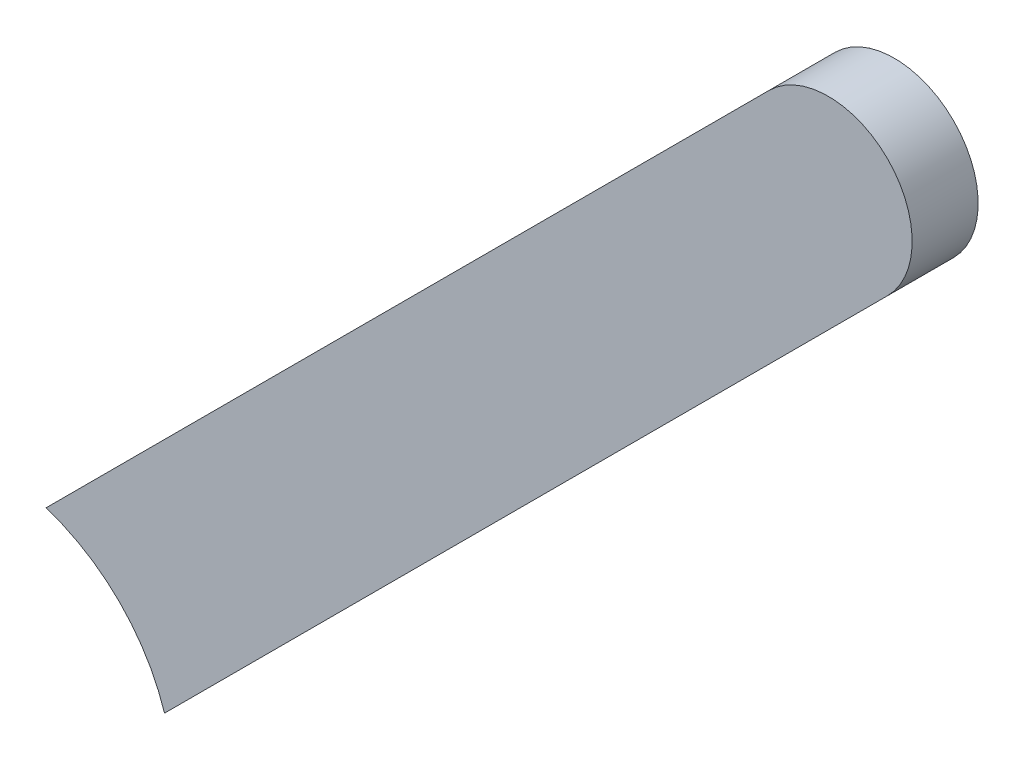
ISO-10303-21;
HEADER;
FILE_DESCRIPTION(('STEP AP214'),'2;1');
FILE_NAME('part.step','',(''),(''),'','','');
FILE_SCHEMA(('AUTOMOTIVE_DESIGN { 1 0 10303 214 1 1 1 1 }'));
ENDSEC;
DATA;
#1=APPLICATION_CONTEXT('core data for automotive mechanical design processes');
#2=APPLICATION_PROTOCOL_DEFINITION('international standard','automotive_design',2000,#1);
#3=PRODUCT_CONTEXT('',#1,'mechanical');
#4=PRODUCT('Part','Part','',(#3));
#5=PRODUCT_RELATED_PRODUCT_CATEGORY('part','',(#4));
#6=PRODUCT_DEFINITION_FORMATION('','',#4);
#7=PRODUCT_DEFINITION_CONTEXT('part definition',#1,'design');
#8=PRODUCT_DEFINITION('design','',#6,#7);
#9=PRODUCT_DEFINITION_SHAPE('','',#8);
#10=(LENGTH_UNIT() NAMED_UNIT(*) SI_UNIT(.MILLI.,.METRE.));
#11=(NAMED_UNIT(*) PLANE_ANGLE_UNIT() SI_UNIT($,.RADIAN.));
#12=(NAMED_UNIT(*) SI_UNIT($,.STERADIAN.) SOLID_ANGLE_UNIT());
#13=UNCERTAINTY_MEASURE_WITH_UNIT(LENGTH_MEASURE(1.E-05),#10,'distance_accuracy_value','');
#14=(GEOMETRIC_REPRESENTATION_CONTEXT(3) GLOBAL_UNCERTAINTY_ASSIGNED_CONTEXT((#13)) GLOBAL_UNIT_ASSIGNED_CONTEXT((#10,
#11,#12)) REPRESENTATION_CONTEXT('',''));
#15=CARTESIAN_POINT('',(0.,0.,0.));
#16=DIRECTION('',(0.,0.,1.));
#17=DIRECTION('',(1.,0.,0.));
#18=AXIS2_PLACEMENT_3D('',#15,#16,#17);
#19=CARTESIAN_POINT('',(109.621539021144,91.0983299411441,0.));
#20=DIRECTION('',(-0.707106781186548,0.707106781186548,0.));
#21=DIRECTION('',(0.707106781186548,0.707106781186548,0.));
#22=AXIS2_PLACEMENT_3D('',#19,#20,#21);
#23=PLANE('',#22);
#24=DIRECTION('',(0.707106781186548,0.707106781186548,0.));
#25=VECTOR('',#24,1.);
#26=CARTESIAN_POINT('',(109.27260594,90.74939686,0.1999996));
#27=LINE('',#26,#25);
#28=CARTESIAN_POINT('',(109.621539021144,91.0983299411441,0.1999996));
#29=VERTEX_POINT('',#28);
#30=CARTESIAN_POINT('',(111.81260594,93.28939686,0.1999996));
#31=VERTEX_POINT('',#30);
#32=EDGE_CURVE('E11',#29,#31,#27,.T.);
#33=ORIENTED_EDGE('',*,*,#32,.F.);
#34=DIRECTION('',(0.,0.,1.));
#35=VECTOR('',#34,1.);
#36=CARTESIAN_POINT('',(109.621539021144,91.0983299411441,0.));
#37=LINE('',#36,#35);
#38=CARTESIAN_POINT('',(109.621539021144,91.0983299411441,0.));
#39=VERTEX_POINT('',#38);
#40=EDGE_CURVE('E24',#39,#29,#37,.T.);
#41=ORIENTED_EDGE('',*,*,#40,.F.);
#42=DIRECTION('',(0.707106781186548,0.707106781186548,0.));
#43=VECTOR('',#42,1.);
#44=CARTESIAN_POINT('',(109.27260594,90.74939686,0.));
#45=LINE('',#44,#43);
#46=CARTESIAN_POINT('',(111.81260594,93.28939686,0.));
#47=VERTEX_POINT('',#46);
#48=EDGE_CURVE('E75',#39,#47,#45,.T.);
#49=ORIENTED_EDGE('',*,*,#48,.T.);
#50=DIRECTION('',(0.,0.,1.));
#51=VECTOR('',#50,1.);
#52=CARTESIAN_POINT('',(111.81260594,93.28939686,0.));
#53=LINE('',#52,#51);
#54=EDGE_CURVE('E37',#47,#31,#53,.T.);
#55=ORIENTED_EDGE('',*,*,#54,.T.);
#56=EDGE_LOOP('',(#33,#41,#49,#55));
#57=FACE_BOUND('',#56,.T.);
#58=ADVANCED_FACE('F17',(#57),#23,.F.);
#59=CARTESIAN_POINT('',(111.633,93.4690028,0.));
#60=DIRECTION('',(0.,0.,-1.));
#61=DIRECTION('',(0.707106781186576,-0.70710678118652,0.));
#62=AXIS2_PLACEMENT_3D('',#59,#60,#61);
#63=CYLINDRICAL_SURFACE('',#62,0.254001156230778);
#64=CARTESIAN_POINT('',(111.633,93.4690028,0.1999996));
#65=DIRECTION('',(0.,0.,1.));
#66=DIRECTION('',(0.707106781186576,-0.70710678118652,0.));
#67=AXIS2_PLACEMENT_3D('',#64,#65,#66);
#68=CIRCLE('',#67,0.254001156230778);
#69=CARTESIAN_POINT('',(111.45339406,93.64860874,0.1999996));
#70=VERTEX_POINT('',#69);
#71=EDGE_CURVE('E83',#31,#70,#68,.T.);
#72=ORIENTED_EDGE('',*,*,#71,.F.);
#73=ORIENTED_EDGE('',*,*,#54,.F.);
#74=CARTESIAN_POINT('',(111.633,93.4690028,0.));
#75=DIRECTION('',(0.,0.,1.));
#76=DIRECTION('',(0.707106781186576,-0.70710678118652,0.));
#77=AXIS2_PLACEMENT_3D('',#74,#75,#76);
#78=CIRCLE('',#77,0.254001156230778);
#79=CARTESIAN_POINT('',(111.45339406,93.64860874,0.));
#80=VERTEX_POINT('',#79);
#81=EDGE_CURVE('E81',#47,#80,#78,.T.);
#82=ORIENTED_EDGE('',*,*,#81,.T.);
#83=DIRECTION('',(0.,0.,1.));
#84=VECTOR('',#83,1.);
#85=CARTESIAN_POINT('',(111.45339406,93.64860874,0.));
#86=LINE('',#85,#84);
#87=EDGE_CURVE('E67',#80,#70,#86,.T.);
#88=ORIENTED_EDGE('',*,*,#87,.T.);
#89=EDGE_LOOP('',(#72,#73,#82,#88));
#90=FACE_BOUND('',#89,.T.);
#91=ADVANCED_FACE('F89',(#90),#63,.T.);
#92=CARTESIAN_POINT('',(111.45339406,93.64860874,0.));
#93=DIRECTION('',(0.70710678118655,-0.707106781186546,0.));
#94=DIRECTION('',(-0.707106781186546,-0.70710678118655,0.));
#95=AXIS2_PLACEMENT_3D('',#92,#93,#94);
#96=PLANE('',#95);
#97=DIRECTION('',(-0.707106781186546,-0.70710678118655,0.));
#98=VECTOR('',#97,1.);
#99=CARTESIAN_POINT('',(111.45339406,93.64860874,0.1999996));
#100=LINE('',#99,#98);
#101=CARTESIAN_POINT('',(109.262327141144,91.4575418211441,0.1999996));
#102=VERTEX_POINT('',#101);
#103=EDGE_CURVE('E71',#70,#102,#100,.T.);
#104=ORIENTED_EDGE('',*,*,#103,.F.);
#105=ORIENTED_EDGE('',*,*,#87,.F.);
#106=DIRECTION('',(-0.707106781186546,-0.70710678118655,0.));
#107=VECTOR('',#106,1.);
#108=CARTESIAN_POINT('',(111.45339406,93.64860874,0.));
#109=LINE('',#108,#107);
#110=CARTESIAN_POINT('',(109.262327141144,91.4575418211441,0.));
#111=VERTEX_POINT('',#110);
#112=EDGE_CURVE('E63',#80,#111,#109,.T.);
#113=ORIENTED_EDGE('',*,*,#112,.T.);
#114=DIRECTION('',(0.,0.,1.));
#115=VECTOR('',#114,1.);
#116=CARTESIAN_POINT('',(109.262327141144,91.4575418211441,0.));
#117=LINE('',#116,#115);
#118=EDGE_CURVE('E53',#111,#102,#117,.T.);
#119=ORIENTED_EDGE('',*,*,#118,.T.);
#120=EDGE_LOOP('',(#104,#105,#113,#119));
#121=FACE_BOUND('',#120,.T.);
#122=ADVANCED_FACE('F66',(#121),#96,.F.);
#123=CARTESIAN_POINT('',(109.093,90.9290028,0.));
#124=DIRECTION('',(0.,0.,-1.));
#125=DIRECTION('',(1.,0.,0.));
#126=AXIS2_PLACEMENT_3D('',#123,#124,#125);
#127=CYLINDRICAL_SURFACE('',#126,0.55500016);
#128=ORIENTED_EDGE('',*,*,#40,.T.);
#129=CARTESIAN_POINT('',(109.093,90.9290028,0.1999996));
#130=DIRECTION('',(0.,0.,1.));
#131=DIRECTION('',(1.,0.,0.));
#132=AXIS2_PLACEMENT_3D('',#129,#130,#131);
#133=CIRCLE('',#132,0.55500016);
#134=EDGE_CURVE('E59',#29,#102,#133,.T.);
#135=ORIENTED_EDGE('',*,*,#134,.T.);
#136=ORIENTED_EDGE('',*,*,#118,.F.);
#137=CARTESIAN_POINT('',(109.093,90.9290028,0.));
#138=DIRECTION('',(0.,0.,1.));
#139=DIRECTION('',(1.,0.,0.));
#140=AXIS2_PLACEMENT_3D('',#137,#138,#139);
#141=CIRCLE('',#140,0.55500016);
#142=EDGE_CURVE('E57',#39,#111,#141,.T.);
#143=ORIENTED_EDGE('',*,*,#142,.F.);
#144=EDGE_LOOP('',(#128,#135,#136,#143));
#145=FACE_BOUND('',#144,.T.);
#146=ADVANCED_FACE('F55',(#145),#127,.F.);
#147=CARTESIAN_POINT('',(109.27260594,90.74939686,0.));
#148=DIRECTION('',(0.,0.,-1.));
#149=DIRECTION('',(-1.,0.,0.));
#150=AXIS2_PLACEMENT_3D('',#147,#148,#149);
#151=PLANE('',#150);
#152=ORIENTED_EDGE('',*,*,#48,.F.);
#153=ORIENTED_EDGE('',*,*,#142,.T.);
#154=ORIENTED_EDGE('',*,*,#112,.F.);
#155=ORIENTED_EDGE('',*,*,#81,.F.);
#156=EDGE_LOOP('',(#152,#153,#154,#155));
#157=FACE_BOUND('',#156,.T.);
#158=ADVANCED_FACE('F74',(#157),#151,.T.);
#159=CARTESIAN_POINT('',(109.27260594,90.74939686,0.1999996));
#160=DIRECTION('',(0.,0.,-1.));
#161=DIRECTION('',(-1.,0.,0.));
#162=AXIS2_PLACEMENT_3D('',#159,#160,#161);
#163=PLANE('',#162);
#164=ORIENTED_EDGE('',*,*,#134,.F.);
#165=ORIENTED_EDGE('',*,*,#32,.T.);
#166=ORIENTED_EDGE('',*,*,#71,.T.);
#167=ORIENTED_EDGE('',*,*,#103,.T.);
#168=EDGE_LOOP('',(#164,#165,#166,#167));
#169=FACE_BOUND('',#168,.T.);
#170=ADVANCED_FACE('F91',(#169),#163,.F.);
#171=CLOSED_SHELL('',(#58,#91,#122,#146,#158,#170));
#172=MANIFOLD_SOLID_BREP('B1',#171);
#173=ADVANCED_BREP_SHAPE_REPRESENTATION('',(#18,#172),#14);
#174=SHAPE_DEFINITION_REPRESENTATION(#9,#173);
ENDSEC;
END-ISO-10303-21;
